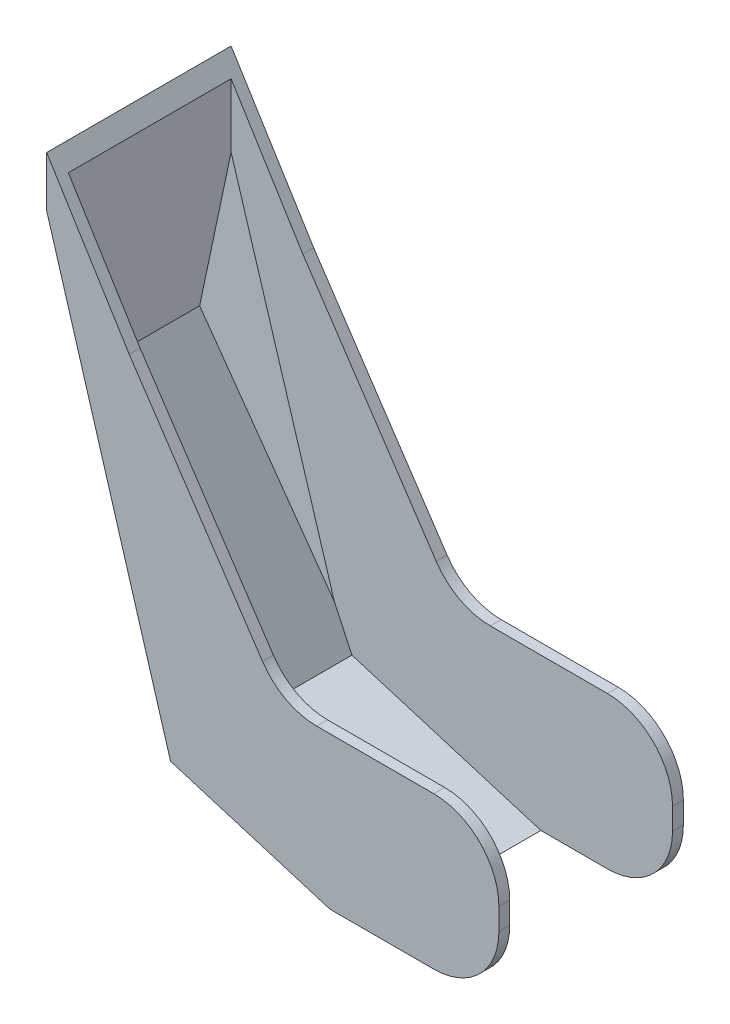
ISO-10303-21;
HEADER;
FILE_DESCRIPTION(('STEP AP214'),'2;1');
FILE_NAME('part.step','',(''),(''),'','','');
FILE_SCHEMA(('AUTOMOTIVE_DESIGN { 1 0 10303 214 1 1 1 1 }'));
ENDSEC;
DATA;
#1=APPLICATION_CONTEXT('core data for automotive mechanical design processes');
#2=APPLICATION_PROTOCOL_DEFINITION('international standard','automotive_design',2000,#1);
#3=PRODUCT_CONTEXT('',#1,'mechanical');
#4=PRODUCT('Part','Part','',(#3));
#5=PRODUCT_RELATED_PRODUCT_CATEGORY('part','',(#4));
#6=PRODUCT_DEFINITION_FORMATION('','',#4);
#7=PRODUCT_DEFINITION_CONTEXT('part definition',#1,'design');
#8=PRODUCT_DEFINITION('design','',#6,#7);
#9=PRODUCT_DEFINITION_SHAPE('','',#8);
#10=(LENGTH_UNIT() NAMED_UNIT(*) SI_UNIT(.MILLI.,.METRE.));
#11=(NAMED_UNIT(*) PLANE_ANGLE_UNIT() SI_UNIT($,.RADIAN.));
#12=(NAMED_UNIT(*) SI_UNIT($,.STERADIAN.) SOLID_ANGLE_UNIT());
#13=UNCERTAINTY_MEASURE_WITH_UNIT(LENGTH_MEASURE(1.E-05),#10,'distance_accuracy_value','');
#14=(GEOMETRIC_REPRESENTATION_CONTEXT(3) GLOBAL_UNCERTAINTY_ASSIGNED_CONTEXT((#13)) GLOBAL_UNIT_ASSIGNED_CONTEXT((#10,
#11,#12)) REPRESENTATION_CONTEXT('',''));
#15=CARTESIAN_POINT('',(0.,0.,0.));
#16=DIRECTION('',(0.,0.,1.));
#17=DIRECTION('',(1.,0.,0.));
#18=AXIS2_PLACEMENT_3D('',#15,#16,#17);
#19=CARTESIAN_POINT('',(-50.,-35.,42.5));
#20=DIRECTION('',(0.,1.,0.));
#21=DIRECTION('',(0.,0.,1.));
#22=AXIS2_PLACEMENT_3D('',#19,#20,#21);
#23=PLANE('',#22);
#24=DIRECTION('',(1.,0.,0.));
#25=VECTOR('',#24,1.);
#26=CARTESIAN_POINT('',(-15.,-35.,2.5));
#27=LINE('',#26,#25);
#28=CARTESIAN_POINT('',(-30.3285437869518,-35.,2.5));
#29=VERTEX_POINT('',#28);
#30=CARTESIAN_POINT('',(-15.0000000000001,-35.,2.5));
#31=VERTEX_POINT('',#30);
#32=EDGE_CURVE('E224',#29,#31,#27,.T.);
#33=ORIENTED_EDGE('',*,*,#32,.F.);
#34=DIRECTION('',(0.,0.,-1.));
#35=VECTOR('',#34,1.);
#36=CARTESIAN_POINT('',(-30.3285437869518,-35.,42.5));
#37=LINE('',#36,#35);
#38=CARTESIAN_POINT('',(-30.3285437869518,-35.,40.));
#39=VERTEX_POINT('',#38);
#40=EDGE_CURVE('E210',#29,#39,#37,.F.);
#41=ORIENTED_EDGE('',*,*,#40,.T.);
#42=DIRECTION('',(1.,0.,0.));
#43=VECTOR('',#42,1.);
#44=CARTESIAN_POINT('',(-15.,-35.,40.));
#45=LINE('',#44,#43);
#46=CARTESIAN_POINT('',(-15.0000000000001,-35.,40.));
#47=VERTEX_POINT('',#46);
#48=EDGE_CURVE('E275',#39,#47,#45,.T.);
#49=ORIENTED_EDGE('',*,*,#48,.T.);
#50=DIRECTION('',(0.,0.,-1.));
#51=VECTOR('',#50,1.);
#52=CARTESIAN_POINT('',(-15.0000000000001,-35.,42.5));
#53=LINE('',#52,#51);
#54=CARTESIAN_POINT('',(-15.0000000000001,-35.,42.5));
#55=VERTEX_POINT('',#54);
#56=EDGE_CURVE('E357',#55,#47,#53,.T.);
#57=ORIENTED_EDGE('',*,*,#56,.F.);
#58=DIRECTION('',(1.,0.,0.));
#59=VECTOR('',#58,1.);
#60=CARTESIAN_POINT('',(-50.,-35.,42.5));
#61=LINE('',#60,#59);
#62=CARTESIAN_POINT('',(-38.9316748594192,-35.,42.5));
#63=VERTEX_POINT('',#62);
#64=EDGE_CURVE('E318',#63,#55,#61,.T.);
#65=ORIENTED_EDGE('',*,*,#64,.F.);
#66=DIRECTION('',(0.,0.,-1.));
#67=VECTOR('',#66,1.);
#68=CARTESIAN_POINT('',(-38.9316748594192,-35.,42.5));
#69=LINE('',#68,#67);
#70=CARTESIAN_POINT('',(-38.9316748594192,-35.,0.));
#71=VERTEX_POINT('',#70);
#72=EDGE_CURVE('E295',#71,#63,#69,.F.);
#73=ORIENTED_EDGE('',*,*,#72,.F.);
#74=DIRECTION('',(1.,0.,0.));
#75=VECTOR('',#74,1.);
#76=CARTESIAN_POINT('',(-50.,-35.,0.));
#77=LINE('',#76,#75);
#78=CARTESIAN_POINT('',(-15.0000000000001,-35.,0.));
#79=VERTEX_POINT('',#78);
#80=EDGE_CURVE('E341',#71,#79,#77,.T.);
#81=ORIENTED_EDGE('',*,*,#80,.T.);
#82=EDGE_CURVE('E356',#31,#79,#53,.T.);
#83=ORIENTED_EDGE('',*,*,#82,.F.);
#84=EDGE_LOOP('',(#33,#41,#49,#57,#65,#73,#81,#83));
#85=FACE_BOUND('',#84,.T.);
#86=ADVANCED_FACE('F33',(#85),#23,.F.);
#87=CARTESIAN_POINT('',(-15.,-15.,42.5));
#88=DIRECTION('',(0.,0.,-1.));
#89=DIRECTION('',(-1.,0.,0.));
#90=AXIS2_PLACEMENT_3D('',#87,#88,#89);
#91=CYLINDRICAL_SURFACE('',#90,15.);
#92=CARTESIAN_POINT('',(-15.,-15.,2.5));
#93=DIRECTION('',(0.,0.,-1.));
#94=DIRECTION('',(-1.,0.,0.));
#95=AXIS2_PLACEMENT_3D('',#92,#93,#94);
#96=CIRCLE('',#95,15.);
#97=CARTESIAN_POINT('',(0.,-15.,2.5));
#98=VERTEX_POINT('',#97);
#99=CARTESIAN_POINT('',(-15.,0.,2.5));
#100=VERTEX_POINT('',#99);
#101=EDGE_CURVE('E282',#98,#100,#96,.F.);
#102=ORIENTED_EDGE('',*,*,#101,.F.);
#103=DIRECTION('',(0.,0.,-1.));
#104=VECTOR('',#103,1.);
#105=CARTESIAN_POINT('',(0.,-15.,42.5));
#106=LINE('',#105,#104);
#107=CARTESIAN_POINT('',(0.,-15.,0.));
#108=VERTEX_POINT('',#107);
#109=EDGE_CURVE('E324',#98,#108,#106,.T.);
#110=ORIENTED_EDGE('',*,*,#109,.T.);
#111=CARTESIAN_POINT('',(-15.,-15.,0.));
#112=DIRECTION('',(0.,0.,1.));
#113=DIRECTION('',(-1.,0.,0.));
#114=AXIS2_PLACEMENT_3D('',#111,#112,#113);
#115=CIRCLE('',#114,15.);
#116=CARTESIAN_POINT('',(-15.,0.,0.));
#117=VERTEX_POINT('',#116);
#118=EDGE_CURVE('E302',#108,#117,#115,.T.);
#119=ORIENTED_EDGE('',*,*,#118,.T.);
#120=DIRECTION('',(0.,0.,-1.));
#121=VECTOR('',#120,1.);
#122=CARTESIAN_POINT('',(-15.,0.,42.5));
#123=LINE('',#122,#121);
#124=EDGE_CURVE('E380',#100,#117,#123,.T.);
#125=ORIENTED_EDGE('',*,*,#124,.F.);
#126=EDGE_LOOP('',(#102,#110,#119,#125));
#127=FACE_BOUND('',#126,.T.);
#128=ADVANCED_FACE('F425',(#127),#91,.T.);
#129=CARTESIAN_POINT('',(-15.,0.,42.5));
#130=DIRECTION('',(0.,-1.,0.));
#131=DIRECTION('',(1.,0.,0.));
#132=AXIS2_PLACEMENT_3D('',#129,#130,#131);
#133=PLANE('',#132);
#134=DIRECTION('',(-1.,0.,0.));
#135=VECTOR('',#134,1.);
#136=CARTESIAN_POINT('',(-15.,0.,2.5));
#137=LINE('',#136,#135);
#138=CARTESIAN_POINT('',(-41.9863501882979,0.,2.5));
#139=VERTEX_POINT('',#138);
#140=EDGE_CURVE('E284',#100,#139,#137,.T.);
#141=ORIENTED_EDGE('',*,*,#140,.F.);
#142=ORIENTED_EDGE('',*,*,#124,.T.);
#143=DIRECTION('',(-1.,0.,0.));
#144=VECTOR('',#143,1.);
#145=CARTESIAN_POINT('',(-15.,0.,0.));
#146=LINE('',#145,#144);
#147=CARTESIAN_POINT('',(-41.9863501882979,0.,0.));
#148=VERTEX_POINT('',#147);
#149=EDGE_CURVE('E327',#117,#148,#146,.T.);
#150=ORIENTED_EDGE('',*,*,#149,.T.);
#151=DIRECTION('',(0.,0.,-1.));
#152=VECTOR('',#151,1.);
#153=CARTESIAN_POINT('',(-41.9863501882979,0.,42.5));
#154=LINE('',#153,#152);
#155=EDGE_CURVE('E376',#139,#148,#154,.T.);
#156=ORIENTED_EDGE('',*,*,#155,.F.);
#157=EDGE_LOOP('',(#141,#142,#150,#156));
#158=FACE_BOUND('',#157,.T.);
#159=ADVANCED_FACE('F462',(#158),#133,.F.);
#160=CARTESIAN_POINT('',(-41.986350188298,15.,42.5));
#161=DIRECTION('',(0.,0.,-1.));
#162=DIRECTION('',(-1.,0.,0.));
#163=AXIS2_PLACEMENT_3D('',#160,#161,#162);
#164=CYLINDRICAL_SURFACE('',#163,15.);
#165=CARTESIAN_POINT('',(-41.986350188298,15.,2.5));
#166=DIRECTION('',(0.,0.,-1.));
#167=DIRECTION('',(-1.,0.,0.));
#168=AXIS2_PLACEMENT_3D('',#165,#166,#167);
#169=CIRCLE('',#168,15.);
#170=CARTESIAN_POINT('',(-54.4549211012123,6.66125072989796,2.5));
#171=VERTEX_POINT('',#170);
#172=EDGE_CURVE('E286',#139,#171,#169,.T.);
#173=ORIENTED_EDGE('',*,*,#172,.F.);
#174=ORIENTED_EDGE('',*,*,#155,.T.);
#175=CARTESIAN_POINT('',(-41.986350188298,15.,0.));
#176=DIRECTION('',(0.,0.,-1.));
#177=DIRECTION('',(-1.,0.,0.));
#178=AXIS2_PLACEMENT_3D('',#175,#176,#177);
#179=CIRCLE('',#178,15.);
#180=CARTESIAN_POINT('',(-54.4549211012123,6.66125072989796,0.));
#181=VERTEX_POINT('',#180);
#182=EDGE_CURVE('E330',#148,#181,#179,.T.);
#183=ORIENTED_EDGE('',*,*,#182,.T.);
#184=DIRECTION('',(0.,0.,-1.));
#185=VECTOR('',#184,1.);
#186=CARTESIAN_POINT('',(-54.4549211012123,6.66125072989796,42.5));
#187=LINE('',#186,#185);
#188=EDGE_CURVE('E372',#171,#181,#187,.T.);
#189=ORIENTED_EDGE('',*,*,#188,.F.);
#190=EDGE_LOOP('',(#173,#174,#183,#189));
#191=FACE_BOUND('',#190,.T.);
#192=ADVANCED_FACE('F416',(#191),#164,.F.);
#193=CARTESIAN_POINT('',(-54.4549211012123,6.66125072989796,42.5));
#194=DIRECTION('',(-0.831238060860952,-0.555916618006806,0.));
#195=DIRECTION('',(0.555916618006806,-0.831238060860952,0.));
#196=AXIS2_PLACEMENT_3D('',#193,#194,#195);
#197=PLANE('',#196);
#198=DIRECTION('',(-0.555916618006806,0.831238060860952,0.));
#199=VECTOR('',#198,1.);
#200=CARTESIAN_POINT('',(-32.2519992105503,-26.5378175116906,2.5));
#201=LINE('',#200,#199);
#202=CARTESIAN_POINT('',(-85.1670973340219,52.5838387397926,2.5));
#203=VERTEX_POINT('',#202);
#204=EDGE_CURVE('E228',#171,#203,#201,.T.);
#205=ORIENTED_EDGE('',*,*,#204,.F.);
#206=ORIENTED_EDGE('',*,*,#188,.T.);
#207=DIRECTION('',(-0.555916618006806,0.831238060860952,0.));
#208=VECTOR('',#207,1.);
#209=CARTESIAN_POINT('',(-54.4549211012123,6.66125072989796,0.));
#210=LINE('',#209,#208);
#211=CARTESIAN_POINT('',(-85.1670973340219,52.5838387397926,0.));
#212=VERTEX_POINT('',#211);
#213=EDGE_CURVE('E333',#181,#212,#210,.T.);
#214=ORIENTED_EDGE('',*,*,#213,.T.);
#215=DIRECTION('',(0.,0.,-1.));
#216=VECTOR('',#215,1.);
#217=CARTESIAN_POINT('',(-85.1670973340219,52.5838387397926,42.5));
#218=LINE('',#217,#216);
#219=EDGE_CURVE('E368',#203,#212,#218,.T.);
#220=ORIENTED_EDGE('',*,*,#219,.F.);
#221=EDGE_LOOP('',(#205,#206,#214,#220));
#222=FACE_BOUND('',#221,.T.);
#223=ADVANCED_FACE('F412',(#222),#197,.F.);
#224=CARTESIAN_POINT('',(-104.196731043032,83.3389212218378,42.5));
#225=DIRECTION('',(-0.850379304895879,-0.526170160503996,0.));
#226=DIRECTION('',(0.526170160503996,-0.850379304895879,0.));
#227=AXIS2_PLACEMENT_3D('',#224,#225,#226);
#228=PLANE('',#227);
#229=DIRECTION('',(-0.526170160503996,0.850379304895879,0.));
#230=VECTOR('',#229,1.);
#231=CARTESIAN_POINT('',(-35.500985253938,-27.684935580453,2.5));
#232=LINE('',#231,#230);
#233=CARTESIAN_POINT('',(-101.696731043032,79.2985015594926,2.5));
#234=VERTEX_POINT('',#233);
#235=EDGE_CURVE('E223',#203,#234,#232,.T.);
#236=ORIENTED_EDGE('',*,*,#235,.F.);
#237=ORIENTED_EDGE('',*,*,#219,.T.);
#238=DIRECTION('',(-0.526170160503996,0.850379304895879,0.));
#239=VECTOR('',#238,1.);
#240=CARTESIAN_POINT('',(-104.196731043032,83.3389212218378,0.));
#241=LINE('',#240,#239);
#242=CARTESIAN_POINT('',(-104.196731043032,83.3389212218378,0.));
#243=VERTEX_POINT('',#242);
#244=EDGE_CURVE('E336',#212,#243,#241,.T.);
#245=ORIENTED_EDGE('',*,*,#244,.T.);
#246=DIRECTION('',(0.,0.,-1.));
#247=VECTOR('',#246,1.);
#248=CARTESIAN_POINT('',(-104.196731043032,83.3389212218378,42.5));
#249=LINE('',#248,#247);
#250=CARTESIAN_POINT('',(-104.196731043032,83.3389212218378,42.5));
#251=VERTEX_POINT('',#250);
#252=EDGE_CURVE('E365',#251,#243,#249,.T.);
#253=ORIENTED_EDGE('',*,*,#252,.F.);
#254=DIRECTION('',(-0.526170160503996,0.850379304895879,0.));
#255=VECTOR('',#254,1.);
#256=CARTESIAN_POINT('',(-104.196731043032,83.3389212218378,42.5));
#257=LINE('',#256,#255);
#258=CARTESIAN_POINT('',(-85.1670973340219,52.5838387397926,42.5));
#259=VERTEX_POINT('',#258);
#260=EDGE_CURVE('E313',#259,#251,#257,.T.);
#261=ORIENTED_EDGE('',*,*,#260,.F.);
#262=CARTESIAN_POINT('',(-85.1670973340219,52.5838387397926,40.));
#263=VERTEX_POINT('',#262);
#264=EDGE_CURVE('E369',#259,#263,#218,.T.);
#265=ORIENTED_EDGE('',*,*,#264,.T.);
#266=DIRECTION('',(-0.526170160503996,0.850379304895879,0.));
#267=VECTOR('',#266,1.);
#268=CARTESIAN_POINT('',(-35.500985253938,-27.684935580453,40.));
#269=LINE('',#268,#267);
#270=CARTESIAN_POINT('',(-101.696731043032,79.2985015594926,40.));
#271=VERTEX_POINT('',#270);
#272=EDGE_CURVE('E257',#263,#271,#269,.T.);
#273=ORIENTED_EDGE('',*,*,#272,.T.);
#274=DIRECTION('',(0.,0.,-1.));
#275=VECTOR('',#274,1.);
#276=CARTESIAN_POINT('',(-101.696731043032,79.2985015594926,42.5));
#277=LINE('',#276,#275);
#278=EDGE_CURVE('E219',#271,#234,#277,.T.);
#279=ORIENTED_EDGE('',*,*,#278,.T.);
#280=EDGE_LOOP('',(#236,#237,#245,#253,#261,#265,#273,#279));
#281=FACE_BOUND('',#280,.T.);
#282=ADVANCED_FACE('F407',(#281),#228,.F.);
#283=CARTESIAN_POINT('',(-15.,-20.,42.5));
#284=DIRECTION('',(0.,0.,-1.));
#285=DIRECTION('',(-1.,0.,0.));
#286=AXIS2_PLACEMENT_3D('',#283,#284,#285);
#287=CYLINDRICAL_SURFACE('',#286,15.);
#288=CARTESIAN_POINT('',(-15.,-20.,2.5));
#289=DIRECTION('',(0.,0.,-1.));
#290=DIRECTION('',(-1.,0.,0.));
#291=AXIS2_PLACEMENT_3D('',#288,#289,#290);
#292=CIRCLE('',#291,15.);
#293=CARTESIAN_POINT('',(0.,-19.9999999999999,2.5));
#294=VERTEX_POINT('',#293);
#295=EDGE_CURVE('E226',#31,#294,#292,.F.);
#296=ORIENTED_EDGE('',*,*,#295,.F.);
#297=ORIENTED_EDGE('',*,*,#82,.T.);
#298=CARTESIAN_POINT('',(-15.,-20.,0.));
#299=DIRECTION('',(0.,0.,1.));
#300=DIRECTION('',(1.,0.,0.));
#301=AXIS2_PLACEMENT_3D('',#298,#299,#300);
#302=CIRCLE('',#301,15.);
#303=CARTESIAN_POINT('',(0.,-19.9999999999999,0.));
#304=VERTEX_POINT('',#303);
#305=EDGE_CURVE('E344',#79,#304,#302,.T.);
#306=ORIENTED_EDGE('',*,*,#305,.T.);
#307=DIRECTION('',(0.,0.,-1.));
#308=VECTOR('',#307,1.);
#309=CARTESIAN_POINT('',(0.,-19.9999999999999,42.5));
#310=LINE('',#309,#308);
#311=EDGE_CURVE('E352',#294,#304,#310,.T.);
#312=ORIENTED_EDGE('',*,*,#311,.F.);
#313=EDGE_LOOP('',(#296,#297,#306,#312));
#314=FACE_BOUND('',#313,.T.);
#315=ADVANCED_FACE('F433',(#314),#287,.T.);
#316=CARTESIAN_POINT('',(0.,-19.9999999999999,42.5));
#317=DIRECTION('',(-1.,0.,0.));
#318=DIRECTION('',(0.,0.,1.));
#319=AXIS2_PLACEMENT_3D('',#316,#317,#318);
#320=PLANE('',#319);
#321=DIRECTION('',(0.,1.,0.));
#322=VECTOR('',#321,1.);
#323=CARTESIAN_POINT('',(0.,-15.,2.5));
#324=LINE('',#323,#322);
#325=EDGE_CURVE('E270',#294,#98,#324,.T.);
#326=ORIENTED_EDGE('',*,*,#325,.F.);
#327=ORIENTED_EDGE('',*,*,#311,.T.);
#328=DIRECTION('',(0.,1.,0.));
#329=VECTOR('',#328,1.);
#330=CARTESIAN_POINT('',(0.,-19.9999999999999,0.));
#331=LINE('',#330,#329);
#332=EDGE_CURVE('E307',#304,#108,#331,.T.);
#333=ORIENTED_EDGE('',*,*,#332,.T.);
#334=ORIENTED_EDGE('',*,*,#109,.F.);
#335=EDGE_LOOP('',(#326,#327,#333,#334));
#336=FACE_BOUND('',#335,.T.);
#337=ADVANCED_FACE('F429',(#336),#320,.F.);
#338=CARTESIAN_POINT('',(-104.196731043032,37.0770518495647,42.5));
#339=DIRECTION('',(1.,0.,0.));
#340=DIRECTION('',(0.,0.,-1.));
#341=AXIS2_PLACEMENT_3D('',#338,#339,#340);
#342=PLANE('',#341);
#343=DIRECTION('',(0.,-0.965867604721735,0.259036233274609));
#344=VECTOR('',#343,1.);
#345=CARTESIAN_POINT('',(-104.196731043032,28.6194461233067,10.9641515928715));
#346=LINE('',#345,#344);
#347=CARTESIAN_POINT('',(-104.196731043032,37.0770518495646,8.69590455865947));
#348=VERTEX_POINT('',#347);
#349=CARTESIAN_POINT('',(-104.196731043032,69.501444378687,0.));
#350=VERTEX_POINT('',#349);
#351=EDGE_CURVE('E56',#348,#350,#346,.F.);
#352=ORIENTED_EDGE('',*,*,#351,.F.);
#353=DIRECTION('',(0.,0.,-1.));
#354=VECTOR('',#353,1.);
#355=CARTESIAN_POINT('',(-104.196731043032,37.0770518495647,42.5));
#356=LINE('',#355,#354);
#357=CARTESIAN_POINT('',(-104.196731043032,37.0770518495647,33.3862464050484));
#358=VERTEX_POINT('',#357);
#359=EDGE_CURVE('E362',#358,#348,#356,.T.);
#360=ORIENTED_EDGE('',*,*,#359,.F.);
#361=DIRECTION('',(0.,0.967141136874529,0.254240086070318));
#362=VECTOR('',#361,1.);
#363=CARTESIAN_POINT('',(-104.196731043032,39.3179966841622,33.9753414046347));
#364=LINE('',#363,#362);
#365=CARTESIAN_POINT('',(-104.196731043032,71.7461952928921,42.5));
#366=VERTEX_POINT('',#365);
#367=EDGE_CURVE('E300',#366,#358,#364,.F.);
#368=ORIENTED_EDGE('',*,*,#367,.F.);
#369=DIRECTION('',(0.,-1.,0.));
#370=VECTOR('',#369,1.);
#371=CARTESIAN_POINT('',(-104.196731043032,37.0770518495647,42.5));
#372=LINE('',#371,#370);
#373=EDGE_CURVE('E315',#251,#366,#372,.T.);
#374=ORIENTED_EDGE('',*,*,#373,.F.);
#375=ORIENTED_EDGE('',*,*,#252,.T.);
#376=DIRECTION('',(0.,-1.,0.));
#377=VECTOR('',#376,1.);
#378=CARTESIAN_POINT('',(-104.196731043032,37.0770518495647,0.));
#379=LINE('',#378,#377);
#380=EDGE_CURVE('E338',#243,#350,#379,.T.);
#381=ORIENTED_EDGE('',*,*,#380,.T.);
#382=EDGE_LOOP('',(#352,#360,#368,#374,#375,#381));
#383=FACE_BOUND('',#382,.T.);
#384=ADVANCED_FACE('F399',(#383),#342,.F.);
#385=CARTESIAN_POINT('',(-104.196731043032,37.0770518495647,42.5));
#386=DIRECTION('',(0.905519885101318,0.424303827093389,0.));
#387=DIRECTION('',(-0.424303827093389,0.905519885101318,0.));
#388=AXIS2_PLACEMENT_3D('',#385,#386,#387);
#389=PLANE('',#388);
#390=DIRECTION('',(0.420803871009053,-0.898050520865179,-0.128177081093217));
#391=VECTOR('',#390,1.);
#392=CARTESIAN_POINT('',(-75.6481772064227,-23.8492974766357,0.));
#393=LINE('',#392,#391);
#394=CARTESIAN_POINT('',(-75.6481772064227,-23.8492974766357,0.));
#395=VERTEX_POINT('',#394);
#396=EDGE_CURVE('E291',#348,#395,#393,.T.);
#397=ORIENTED_EDGE('',*,*,#396,.T.);
#398=DIRECTION('',(0.,0.,-1.));
#399=VECTOR('',#398,1.);
#400=CARTESIAN_POINT('',(-75.6481772064226,-23.8492974766357,42.5));
#401=LINE('',#400,#399);
#402=CARTESIAN_POINT('',(-75.6481772064227,-23.8492974766357,42.5));
#403=VERTEX_POINT('',#402);
#404=EDGE_CURVE('E360',#403,#395,#401,.T.);
#405=ORIENTED_EDGE('',*,*,#404,.F.);
#406=DIRECTION('',(-0.420464097357885,0.897325399435862,-0.134227681050851));
#407=VECTOR('',#406,1.);
#408=CARTESIAN_POINT('',(-129.348059892408,90.7532785427067,25.3570125940922));
#409=LINE('',#408,#407);
#410=EDGE_CURVE('E255',#403,#358,#409,.T.);
#411=ORIENTED_EDGE('',*,*,#410,.T.);
#412=ORIENTED_EDGE('',*,*,#359,.T.);
#413=EDGE_LOOP('',(#397,#405,#411,#412));
#414=FACE_BOUND('',#413,.T.);
#415=ADVANCED_FACE('F395',(#414),#389,.F.);
#416=CARTESIAN_POINT('',(-15.,-15.,42.5));
#417=DIRECTION('',(0.,0.,-1.));
#418=DIRECTION('',(-1.,0.,0.));
#419=AXIS2_PLACEMENT_3D('',#416,#417,#418);
#420=PLANE('',#419);
#421=DIRECTION('',(0.956847094083312,-0.290591876253141,0.));
#422=VECTOR('',#421,1.);
#423=CARTESIAN_POINT('',(-22.5819175487297,-39.9653771042159,42.5));
#424=LINE('',#423,#422);
#425=EDGE_CURVE('E297',#63,#403,#424,.F.);
#426=ORIENTED_EDGE('',*,*,#425,.F.);
#427=ORIENTED_EDGE('',*,*,#64,.T.);
#428=CARTESIAN_POINT('',(-15.,-20.,42.5));
#429=DIRECTION('',(0.,0.,1.));
#430=DIRECTION('',(1.,0.,0.));
#431=AXIS2_PLACEMENT_3D('',#428,#429,#430);
#432=CIRCLE('',#431,15.);
#433=CARTESIAN_POINT('',(0.,-19.9999999999999,42.5));
#434=VERTEX_POINT('',#433);
#435=EDGE_CURVE('E320',#55,#434,#432,.T.);
#436=ORIENTED_EDGE('',*,*,#435,.T.);
#437=DIRECTION('',(0.,1.,0.));
#438=VECTOR('',#437,1.);
#439=CARTESIAN_POINT('',(0.,-19.9999999999999,42.5));
#440=LINE('',#439,#438);
#441=CARTESIAN_POINT('',(0.,-15.,42.5));
#442=VERTEX_POINT('',#441);
#443=EDGE_CURVE('E322',#434,#442,#440,.T.);
#444=ORIENTED_EDGE('',*,*,#443,.T.);
#445=CARTESIAN_POINT('',(-15.,-15.,42.5));
#446=DIRECTION('',(0.,0.,1.));
#447=DIRECTION('',(-1.,0.,0.));
#448=AXIS2_PLACEMENT_3D('',#445,#446,#447);
#449=CIRCLE('',#448,15.);
#450=CARTESIAN_POINT('',(-15.,0.,42.5));
#451=VERTEX_POINT('',#450);
#452=EDGE_CURVE('E303',#442,#451,#449,.T.);
#453=ORIENTED_EDGE('',*,*,#452,.T.);
#454=DIRECTION('',(-1.,0.,0.));
#455=VECTOR('',#454,1.);
#456=CARTESIAN_POINT('',(-15.,0.,42.5));
#457=LINE('',#456,#455);
#458=CARTESIAN_POINT('',(-41.9863501882979,0.,42.5));
#459=VERTEX_POINT('',#458);
#460=EDGE_CURVE('E306',#451,#459,#457,.T.);
#461=ORIENTED_EDGE('',*,*,#460,.T.);
#462=CARTESIAN_POINT('',(-41.986350188298,15.,42.5));
#463=DIRECTION('',(0.,0.,-1.));
#464=DIRECTION('',(-1.,0.,0.));
#465=AXIS2_PLACEMENT_3D('',#462,#463,#464);
#466=CIRCLE('',#465,15.);
#467=CARTESIAN_POINT('',(-54.4549211012123,6.66125072989796,42.5));
#468=VERTEX_POINT('',#467);
#469=EDGE_CURVE('E309',#459,#468,#466,.T.);
#470=ORIENTED_EDGE('',*,*,#469,.T.);
#471=DIRECTION('',(-0.555916618006806,0.831238060860952,0.));
#472=VECTOR('',#471,1.);
#473=CARTESIAN_POINT('',(-54.4549211012123,6.66125072989796,42.5));
#474=LINE('',#473,#472);
#475=EDGE_CURVE('E311',#468,#259,#474,.T.);
#476=ORIENTED_EDGE('',*,*,#475,.T.);
#477=ORIENTED_EDGE('',*,*,#260,.T.);
#478=ORIENTED_EDGE('',*,*,#373,.T.);
#479=DIRECTION('',(0.28615135499431,-0.958184430073313,0.));
#480=VECTOR('',#479,1.);
#481=CARTESIAN_POINT('',(-73.1084983640519,-32.3534708159324,42.5));
#482=LINE('',#481,#480);
#483=EDGE_CURVE('E12',#403,#366,#482,.F.);
#484=ORIENTED_EDGE('',*,*,#483,.F.);
#485=EDGE_LOOP('',(#426,#427,#436,#444,#453,#461,#470,#476,#477,#478,#484));
#486=FACE_BOUND('',#485,.T.);
#487=ADVANCED_FACE('F443',(#486),#420,.F.);
#488=CARTESIAN_POINT('',(-15.,-15.,0.));
#489=DIRECTION('',(0.,0.,-1.));
#490=DIRECTION('',(-1.,0.,0.));
#491=AXIS2_PLACEMENT_3D('',#488,#489,#490);
#492=PLANE('',#491);
#493=ORIENTED_EDGE('',*,*,#80,.F.);
#494=DIRECTION('',(0.956847094083312,-0.290591876253141,0.));
#495=VECTOR('',#494,1.);
#496=CARTESIAN_POINT('',(-22.5819175487297,-39.9653771042159,0.));
#497=LINE('',#496,#495);
#498=EDGE_CURVE('E41',#71,#395,#497,.F.);
#499=ORIENTED_EDGE('',*,*,#498,.T.);
#500=DIRECTION('',(0.292450096783216,-0.956280785591495,0.));
#501=VECTOR('',#500,1.);
#502=CARTESIAN_POINT('',(-72.9359505123232,-32.7179909811493,0.));
#503=LINE('',#502,#501);
#504=EDGE_CURVE('E384',#395,#350,#503,.F.);
#505=ORIENTED_EDGE('',*,*,#504,.T.);
#506=ORIENTED_EDGE('',*,*,#380,.F.);
#507=ORIENTED_EDGE('',*,*,#244,.F.);
#508=ORIENTED_EDGE('',*,*,#213,.F.);
#509=ORIENTED_EDGE('',*,*,#182,.F.);
#510=ORIENTED_EDGE('',*,*,#149,.F.);
#511=ORIENTED_EDGE('',*,*,#118,.F.);
#512=ORIENTED_EDGE('',*,*,#332,.F.);
#513=ORIENTED_EDGE('',*,*,#305,.F.);
#514=EDGE_LOOP('',(#493,#499,#505,#506,#507,#508,#509,#510,#511,#512,#513));
#515=FACE_BOUND('',#514,.T.);
#516=ADVANCED_FACE('F388',(#515),#492,.T.);
#517=CARTESIAN_POINT('',(0.,-15.,40.));
#518=VERTEX_POINT('',#517);
#519=EDGE_CURVE('E349',#442,#518,#106,.T.);
#520=ORIENTED_EDGE('',*,*,#519,.T.);
#521=CARTESIAN_POINT('',(-15.,-15.,40.));
#522=DIRECTION('',(0.,0.,-1.));
#523=DIRECTION('',(-1.,0.,0.));
#524=AXIS2_PLACEMENT_3D('',#521,#522,#523);
#525=CIRCLE('',#524,15.);
#526=CARTESIAN_POINT('',(-15.,0.,40.));
#527=VERTEX_POINT('',#526);
#528=EDGE_CURVE('E48',#518,#527,#525,.F.);
#529=ORIENTED_EDGE('',*,*,#528,.T.);
#530=EDGE_CURVE('E381',#451,#527,#123,.T.);
#531=ORIENTED_EDGE('',*,*,#530,.F.);
#532=ORIENTED_EDGE('',*,*,#452,.F.);
#533=EDGE_LOOP('',(#520,#529,#531,#532));
#534=FACE_BOUND('',#533,.T.);
#535=ADVANCED_FACE('F35',(#534),#91,.T.);
#536=ORIENTED_EDGE('',*,*,#530,.T.);
#537=DIRECTION('',(-1.,0.,0.));
#538=VECTOR('',#537,1.);
#539=CARTESIAN_POINT('',(-15.,0.,40.));
#540=LINE('',#539,#538);
#541=CARTESIAN_POINT('',(-41.9863501882979,0.,40.));
#542=VERTEX_POINT('',#541);
#543=EDGE_CURVE('E266',#527,#542,#540,.T.);
#544=ORIENTED_EDGE('',*,*,#543,.T.);
#545=EDGE_CURVE('E377',#459,#542,#154,.T.);
#546=ORIENTED_EDGE('',*,*,#545,.F.);
#547=ORIENTED_EDGE('',*,*,#460,.F.);
#548=EDGE_LOOP('',(#536,#544,#546,#547));
#549=FACE_BOUND('',#548,.T.);
#550=ADVANCED_FACE('F479',(#549),#133,.F.);
#551=ORIENTED_EDGE('',*,*,#545,.T.);
#552=CARTESIAN_POINT('',(-41.986350188298,15.,40.));
#553=DIRECTION('',(0.,0.,-1.));
#554=DIRECTION('',(-1.,0.,0.));
#555=AXIS2_PLACEMENT_3D('',#552,#553,#554);
#556=CIRCLE('',#555,15.);
#557=CARTESIAN_POINT('',(-54.4549211012123,6.66125072989796,40.));
#558=VERTEX_POINT('',#557);
#559=EDGE_CURVE('E263',#542,#558,#556,.T.);
#560=ORIENTED_EDGE('',*,*,#559,.T.);
#561=EDGE_CURVE('E373',#468,#558,#187,.T.);
#562=ORIENTED_EDGE('',*,*,#561,.F.);
#563=ORIENTED_EDGE('',*,*,#469,.F.);
#564=EDGE_LOOP('',(#551,#560,#562,#563));
#565=FACE_BOUND('',#564,.T.);
#566=ADVANCED_FACE('F476',(#565),#164,.F.);
#567=ORIENTED_EDGE('',*,*,#561,.T.);
#568=DIRECTION('',(-0.555916618006806,0.831238060860952,0.));
#569=VECTOR('',#568,1.);
#570=CARTESIAN_POINT('',(-32.2519992105503,-26.5378175116906,40.));
#571=LINE('',#570,#569);
#572=EDGE_CURVE('E260',#558,#263,#571,.T.);
#573=ORIENTED_EDGE('',*,*,#572,.T.);
#574=ORIENTED_EDGE('',*,*,#264,.F.);
#575=ORIENTED_EDGE('',*,*,#475,.F.);
#576=EDGE_LOOP('',(#567,#573,#574,#575));
#577=FACE_BOUND('',#576,.T.);
#578=ADVANCED_FACE('F473',(#577),#197,.F.);
#579=ORIENTED_EDGE('',*,*,#56,.T.);
#580=CARTESIAN_POINT('',(-15.,-20.,40.));
#581=DIRECTION('',(0.,0.,-1.));
#582=DIRECTION('',(-1.,0.,0.));
#583=AXIS2_PLACEMENT_3D('',#580,#581,#582);
#584=CIRCLE('',#583,15.);
#585=CARTESIAN_POINT('',(0.,-19.9999999999999,40.));
#586=VERTEX_POINT('',#585);
#587=EDGE_CURVE('E272',#47,#586,#584,.F.);
#588=ORIENTED_EDGE('',*,*,#587,.T.);
#589=EDGE_CURVE('E353',#434,#586,#310,.T.);
#590=ORIENTED_EDGE('',*,*,#589,.F.);
#591=ORIENTED_EDGE('',*,*,#435,.F.);
#592=EDGE_LOOP('',(#579,#588,#590,#591));
#593=FACE_BOUND('',#592,.T.);
#594=ADVANCED_FACE('F465',(#593),#287,.T.);
#595=ORIENTED_EDGE('',*,*,#589,.T.);
#596=DIRECTION('',(0.,1.,0.));
#597=VECTOR('',#596,1.);
#598=CARTESIAN_POINT('',(0.,-15.,40.));
#599=LINE('',#598,#597);
#600=EDGE_CURVE('E239',#586,#518,#599,.T.);
#601=ORIENTED_EDGE('',*,*,#600,.T.);
#602=ORIENTED_EDGE('',*,*,#519,.F.);
#603=ORIENTED_EDGE('',*,*,#443,.F.);
#604=EDGE_LOOP('',(#595,#601,#602,#603));
#605=FACE_BOUND('',#604,.T.);
#606=ADVANCED_FACE('F503',(#605),#320,.F.);
#607=CARTESIAN_POINT('',(-75.6481772064227,-23.8492974766357,0.));
#608=DIRECTION('',(0.646327763627794,0.197660164121893,0.737014844818746));
#609=DIRECTION('',(0.751848357862344,0.,-0.659336065128927));
#610=AXIS2_PLACEMENT_3D('',#607,#608,#609);
#611=PLANE('',#610);
#612=ORIENTED_EDGE('',*,*,#351,.T.);
#613=ORIENTED_EDGE('',*,*,#504,.F.);
#614=ORIENTED_EDGE('',*,*,#396,.F.);
#615=EDGE_LOOP('',(#612,#613,#614));
#616=FACE_BOUND('',#615,.T.);
#617=ADVANCED_FACE('F397',(#616),#611,.F.);
#618=CARTESIAN_POINT('',(-75.6481772064227,-23.8492974766357,42.5));
#619=DIRECTION('',(0.290591876253141,0.956847094083312,0.));
#620=DIRECTION('',(-0.956847094083312,0.290591876253141,0.));
#621=AXIS2_PLACEMENT_3D('',#618,#619,#620);
#622=PLANE('',#621);
#623=ORIENTED_EDGE('',*,*,#425,.T.);
#624=ORIENTED_EDGE('',*,*,#404,.T.);
#625=ORIENTED_EDGE('',*,*,#498,.F.);
#626=ORIENTED_EDGE('',*,*,#72,.T.);
#627=EDGE_LOOP('',(#623,#624,#625,#626));
#628=FACE_BOUND('',#627,.T.);
#629=ADVANCED_FACE('F440',(#628),#622,.F.);
#630=CARTESIAN_POINT('',(-129.348059892408,90.7532785427067,25.3570125940922));
#631=DIRECTION('',(0.648235633926837,0.193588519268224,-0.736419749949041));
#632=DIRECTION('',(-0.750619356980236,0.,-0.66073487945361));
#633=AXIS2_PLACEMENT_3D('',#630,#631,#632);
#634=PLANE('',#633);
#635=ORIENTED_EDGE('',*,*,#367,.T.);
#636=ORIENTED_EDGE('',*,*,#410,.F.);
#637=ORIENTED_EDGE('',*,*,#483,.T.);
#638=EDGE_LOOP('',(#635,#636,#637));
#639=FACE_BOUND('',#638,.T.);
#640=ADVANCED_FACE('F445',(#639),#634,.F.);
#641=CARTESIAN_POINT('',(-101.696731043032,37.0770518495647,42.5));
#642=DIRECTION('',(1.,0.,0.));
#643=DIRECTION('',(0.,0.,-1.));
#644=AXIS2_PLACEMENT_3D('',#641,#642,#643);
#645=PLANE('',#644);
#646=DIRECTION('',(0.,-0.965867604721735,0.259036233274609));
#647=VECTOR('',#646,1.);
#648=CARTESIAN_POINT('',(-101.696731043032,28.9195992405789,12.0833315962426));
#649=LINE('',#648,#647);
#650=CARTESIAN_POINT('',(-101.696731043032,37.6337290986594,9.74628730190244));
#651=VERTEX_POINT('',#650);
#652=CARTESIAN_POINT('',(-101.696731043032,64.6529382298944,2.5));
#653=VERTEX_POINT('',#652);
#654=EDGE_CURVE('E201',#651,#653,#649,.F.);
#655=ORIENTED_EDGE('',*,*,#654,.T.);
#656=DIRECTION('',(0.,-1.,0.));
#657=VECTOR('',#656,1.);
#658=CARTESIAN_POINT('',(-101.696731043032,-15.,2.5));
#659=LINE('',#658,#657);
#660=EDGE_CURVE('E205',#234,#653,#659,.T.);
#661=ORIENTED_EDGE('',*,*,#660,.F.);
#662=ORIENTED_EDGE('',*,*,#278,.F.);
#663=DIRECTION('',(0.,-1.,0.));
#664=VECTOR('',#663,1.);
#665=CARTESIAN_POINT('',(-101.696731043032,-15.,40.));
#666=LINE('',#665,#664);
#667=CARTESIAN_POINT('',(-101.696731043032,66.7787599133317,40.));
#668=VERTEX_POINT('',#667);
#669=EDGE_CURVE('E232',#271,#668,#666,.T.);
#670=ORIENTED_EDGE('',*,*,#669,.T.);
#671=DIRECTION('',(0.,0.967141136874529,0.254240086070318));
#672=VECTOR('',#671,1.);
#673=CARTESIAN_POINT('',(-101.696731043032,39.6116266046715,32.8583595016974));
#674=LINE('',#673,#672);
#675=CARTESIAN_POINT('',(-101.696731043032,37.6337290986594,32.3384138464109));
#676=VERTEX_POINT('',#675);
#677=EDGE_CURVE('E245',#668,#676,#674,.F.);
#678=ORIENTED_EDGE('',*,*,#677,.T.);
#679=DIRECTION('',(0.,0.,-1.));
#680=VECTOR('',#679,1.);
#681=CARTESIAN_POINT('',(-101.696731043032,37.6337290986594,42.5));
#682=LINE('',#681,#680);
#683=EDGE_CURVE('E208',#676,#651,#682,.T.);
#684=ORIENTED_EDGE('',*,*,#683,.T.);
#685=EDGE_LOOP('',(#655,#661,#662,#670,#678,#684));
#686=FACE_BOUND('',#685,.T.);
#687=ADVANCED_FACE('F203',(#686),#645,.T.);
#688=CARTESIAN_POINT('',(-101.932931330279,38.1378114172981,42.5));
#689=DIRECTION('',(0.905519885101318,0.424303827093389,0.));
#690=DIRECTION('',(-0.424303827093389,0.905519885101318,0.));
#691=AXIS2_PLACEMENT_3D('',#688,#689,#690);
#692=PLANE('',#691);
#693=DIRECTION('',(-0.420803871009053,0.898050520865179,0.128177081093216));
#694=VECTOR('',#693,1.);
#695=CARTESIAN_POINT('',(-73.3238419464719,-22.9177286874022,1.10389031572924));
#696=LINE('',#695,#694);
#697=CARTESIAN_POINT('',(-77.9072538519678,-13.1361279640056,2.5));
#698=VERTEX_POINT('',#697);
#699=EDGE_CURVE('E211',#651,#698,#696,.F.);
#700=ORIENTED_EDGE('',*,*,#699,.F.);
#701=ORIENTED_EDGE('',*,*,#683,.F.);
#702=DIRECTION('',(0.420464097357884,-0.897325399435863,0.134227681050851));
#703=VECTOR('',#702,1.);
#704=CARTESIAN_POINT('',(-127.020867051553,91.6787488803898,24.2540136029655));
#705=LINE('',#704,#703);
#706=CARTESIAN_POINT('',(-77.6970472134494,-13.5847364351163,40.));
#707=VERTEX_POINT('',#706);
#708=EDGE_CURVE('E235',#707,#676,#705,.F.);
#709=ORIENTED_EDGE('',*,*,#708,.F.);
#710=DIRECTION('',(-0.424303827093389,0.905519885101318,0.));
#711=VECTOR('',#710,1.);
#712=CARTESIAN_POINT('',(-101.932931330279,38.1378114172981,40.));
#713=LINE('',#712,#711);
#714=CARTESIAN_POINT('',(-73.8566580814398,-21.7806293389912,40.));
#715=VERTEX_POINT('',#714);
#716=EDGE_CURVE('E248',#715,#707,#713,.T.);
#717=ORIENTED_EDGE('',*,*,#716,.F.);
#718=DIRECTION('',(0.,0.,1.));
#719=VECTOR('',#718,1.);
#720=CARTESIAN_POINT('',(-73.8566580814398,-21.7806293389912,42.5));
#721=LINE('',#720,#719);
#722=CARTESIAN_POINT('',(-73.8566580814398,-21.7806293389912,2.5));
#723=VERTEX_POINT('',#722);
#724=EDGE_CURVE('E236',#715,#723,#721,.F.);
#725=ORIENTED_EDGE('',*,*,#724,.T.);
#726=DIRECTION('',(-0.424303827093389,0.905519885101318,0.));
#727=VECTOR('',#726,1.);
#728=CARTESIAN_POINT('',(-101.932931330279,38.1378114172981,2.5));
#729=LINE('',#728,#727);
#730=EDGE_CURVE('E253',#723,#698,#729,.T.);
#731=ORIENTED_EDGE('',*,*,#730,.T.);
#732=EDGE_LOOP('',(#700,#701,#709,#717,#725,#731));
#733=FACE_BOUND('',#732,.T.);
#734=ADVANCED_FACE('F452',(#733),#692,.T.);
#735=CARTESIAN_POINT('',(-15.,-15.,40.));
#736=DIRECTION('',(0.,0.,-1.));
#737=DIRECTION('',(-1.,0.,0.));
#738=AXIS2_PLACEMENT_3D('',#735,#736,#737);
#739=PLANE('',#738);
#740=DIRECTION('',(0.956847094083312,-0.290591876253141,0.));
#741=VECTOR('',#740,1.);
#742=CARTESIAN_POINT('',(-21.8554378580969,-37.5732593690076,40.));
#743=LINE('',#742,#741);
#744=EDGE_CURVE('E242',#39,#715,#743,.F.);
#745=ORIENTED_EDGE('',*,*,#744,.T.);
#746=ORIENTED_EDGE('',*,*,#716,.T.);
#747=DIRECTION('',(0.28615135499431,-0.958184430073313,0.));
#748=VECTOR('',#747,1.);
#749=CARTESIAN_POINT('',(-72.1752049683366,-32.0747528975347,40.));
#750=LINE('',#749,#748);
#751=EDGE_CURVE('E246',#707,#668,#750,.F.);
#752=ORIENTED_EDGE('',*,*,#751,.T.);
#753=ORIENTED_EDGE('',*,*,#669,.F.);
#754=ORIENTED_EDGE('',*,*,#272,.F.);
#755=ORIENTED_EDGE('',*,*,#572,.F.);
#756=ORIENTED_EDGE('',*,*,#559,.F.);
#757=ORIENTED_EDGE('',*,*,#543,.F.);
#758=ORIENTED_EDGE('',*,*,#528,.F.);
#759=ORIENTED_EDGE('',*,*,#600,.F.);
#760=ORIENTED_EDGE('',*,*,#587,.F.);
#761=ORIENTED_EDGE('',*,*,#48,.F.);
#762=EDGE_LOOP('',(#745,#746,#752,#753,#754,#755,#756,#757,#758,#759,#760,#761));
#763=FACE_BOUND('',#762,.T.);
#764=ADVANCED_FACE('F497',(#763),#739,.T.);
#765=CARTESIAN_POINT('',(-15.,-15.,2.5));
#766=DIRECTION('',(0.,0.,-1.));
#767=DIRECTION('',(-1.,0.,0.));
#768=AXIS2_PLACEMENT_3D('',#765,#766,#767);
#769=PLANE('',#768);
#770=ORIENTED_EDGE('',*,*,#32,.T.);
#771=ORIENTED_EDGE('',*,*,#295,.T.);
#772=ORIENTED_EDGE('',*,*,#325,.T.);
#773=ORIENTED_EDGE('',*,*,#101,.T.);
#774=ORIENTED_EDGE('',*,*,#140,.T.);
#775=ORIENTED_EDGE('',*,*,#172,.T.);
#776=ORIENTED_EDGE('',*,*,#204,.T.);
#777=ORIENTED_EDGE('',*,*,#235,.T.);
#778=ORIENTED_EDGE('',*,*,#660,.T.);
#779=DIRECTION('',(0.292450096783216,-0.956280785591495,0.));
#780=VECTOR('',#779,1.);
#781=CARTESIAN_POINT('',(-72.0057227633265,-32.4335084323797,2.5));
#782=LINE('',#781,#780);
#783=EDGE_CURVE('E214',#698,#653,#782,.F.);
#784=ORIENTED_EDGE('',*,*,#783,.F.);
#785=ORIENTED_EDGE('',*,*,#730,.F.);
#786=DIRECTION('',(0.956847094083312,-0.290591876253141,0.));
#787=VECTOR('',#786,1.);
#788=CARTESIAN_POINT('',(-21.8554378580969,-37.5732593690076,2.5));
#789=LINE('',#788,#787);
#790=EDGE_CURVE('E218',#29,#723,#789,.F.);
#791=ORIENTED_EDGE('',*,*,#790,.F.);
#792=EDGE_LOOP('',(#770,#771,#772,#773,#774,#775,#776,#777,#778,#784,#785,#791));
#793=FACE_BOUND('',#792,.T.);
#794=ADVANCED_FACE('F221',(#793),#769,.F.);
#795=CARTESIAN_POINT('',(-74.0323577973532,-23.3551470663309,1.84253711204686));
#796=DIRECTION('',(0.646327763627794,0.197660164121893,0.737014844818746));
#797=DIRECTION('',(0.751848357862344,0.,-0.659336065128927));
#798=AXIS2_PLACEMENT_3D('',#795,#796,#797);
#799=PLANE('',#798);
#800=ORIENTED_EDGE('',*,*,#654,.F.);
#801=ORIENTED_EDGE('',*,*,#699,.T.);
#802=ORIENTED_EDGE('',*,*,#783,.T.);
#803=EDGE_LOOP('',(#800,#801,#802));
#804=FACE_BOUND('',#803,.T.);
#805=ADVANCED_FACE('F215',(#804),#799,.T.);
#806=CARTESIAN_POINT('',(-74.9216975157898,-21.4571797414274,42.5));
#807=DIRECTION('',(0.290591876253141,0.956847094083312,0.));
#808=DIRECTION('',(-0.956847094083312,0.290591876253141,0.));
#809=AXIS2_PLACEMENT_3D('',#806,#807,#808);
#810=PLANE('',#809);
#811=ORIENTED_EDGE('',*,*,#744,.F.);
#812=ORIENTED_EDGE('',*,*,#40,.F.);
#813=ORIENTED_EDGE('',*,*,#790,.T.);
#814=ORIENTED_EDGE('',*,*,#724,.F.);
#815=EDGE_LOOP('',(#811,#812,#813,#814));
#816=FACE_BOUND('',#815,.T.);
#817=ADVANCED_FACE('F495',(#816),#810,.T.);
#818=CARTESIAN_POINT('',(-127.727470807591,91.2372498408773,23.5159632192196));
#819=DIRECTION('',(0.648235633926837,0.193588519268224,-0.736419749949041));
#820=DIRECTION('',(-0.750619356980236,0.,-0.66073487945361));
#821=AXIS2_PLACEMENT_3D('',#818,#819,#820);
#822=PLANE('',#821);
#823=ORIENTED_EDGE('',*,*,#677,.F.);
#824=ORIENTED_EDGE('',*,*,#751,.F.);
#825=ORIENTED_EDGE('',*,*,#708,.T.);
#826=EDGE_LOOP('',(#823,#824,#825));
#827=FACE_BOUND('',#826,.T.);
#828=ADVANCED_FACE('F517',(#827),#822,.T.);
#829=CLOSED_SHELL('',(#86,#128,#159,#192,#223,#282,#315,#337,#384,#415,#487,#516,#535,#550,#566,
#578,#594,#606,#617,#629,#640,#687,#734,#764,#794,#805,#817,#828));
#830=MANIFOLD_SOLID_BREP('B2',#829);
#831=ADVANCED_BREP_SHAPE_REPRESENTATION('',(#18,#830),#14);
#832=SHAPE_DEFINITION_REPRESENTATION(#9,#831);
ENDSEC;
END-ISO-10303-21;
